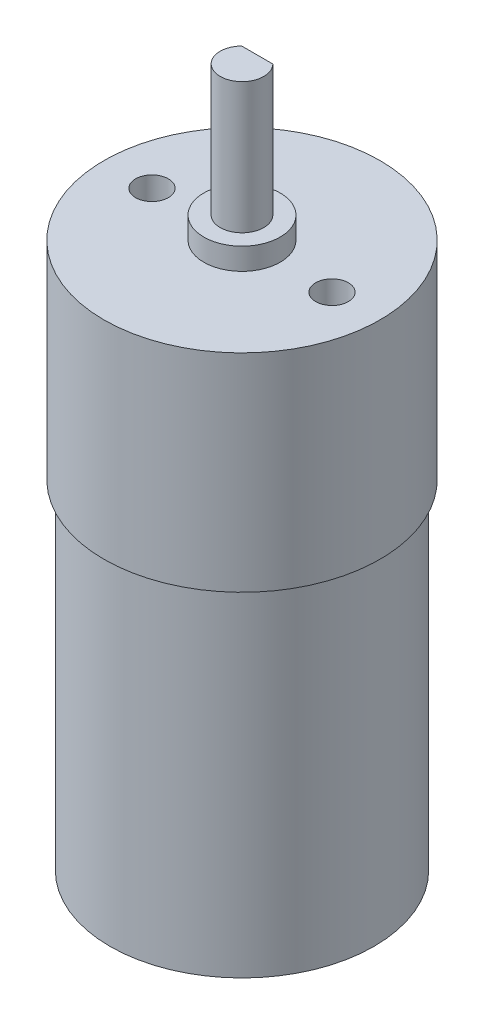
ISO-10303-21;
HEADER;
FILE_DESCRIPTION(('STEP AP214'),'2;1');
FILE_NAME('part.step','',(''),(''),'','','');
FILE_SCHEMA(('AUTOMOTIVE_DESIGN { 1 0 10303 214 1 1 1 1 }'));
ENDSEC;
DATA;
#1=APPLICATION_CONTEXT('core data for automotive mechanical design processes');
#2=APPLICATION_PROTOCOL_DEFINITION('international standard','automotive_design',2000,#1);
#3=PRODUCT_CONTEXT('',#1,'mechanical');
#4=PRODUCT('Part','Part','',(#3));
#5=PRODUCT_RELATED_PRODUCT_CATEGORY('part','',(#4));
#6=PRODUCT_DEFINITION_FORMATION('','',#4);
#7=PRODUCT_DEFINITION_CONTEXT('part definition',#1,'design');
#8=PRODUCT_DEFINITION('design','',#6,#7);
#9=PRODUCT_DEFINITION_SHAPE('','',#8);
#10=(LENGTH_UNIT() NAMED_UNIT(*) SI_UNIT(.MILLI.,.METRE.));
#11=(NAMED_UNIT(*) PLANE_ANGLE_UNIT() SI_UNIT($,.RADIAN.));
#12=(NAMED_UNIT(*) SI_UNIT($,.STERADIAN.) SOLID_ANGLE_UNIT());
#13=UNCERTAINTY_MEASURE_WITH_UNIT(LENGTH_MEASURE(1.E-05),#10,'distance_accuracy_value','');
#14=(GEOMETRIC_REPRESENTATION_CONTEXT(3) GLOBAL_UNCERTAINTY_ASSIGNED_CONTEXT((#13)) GLOBAL_UNIT_ASSIGNED_CONTEXT((#10,
#11,#12)) REPRESENTATION_CONTEXT('',''));
#15=CARTESIAN_POINT('',(0.,0.,0.));
#16=DIRECTION('',(0.,0.,1.));
#17=DIRECTION('',(1.,0.,0.));
#18=AXIS2_PLACEMENT_3D('',#15,#16,#17);
#19=CARTESIAN_POINT('',(0.,31.,0.));
#20=DIRECTION('',(0.,-1.,0.));
#21=DIRECTION('',(0.,0.,-1.));
#22=AXIS2_PLACEMENT_3D('',#19,#20,#21);
#23=CYLINDRICAL_SURFACE('',#22,12.1);
#24=CARTESIAN_POINT('',(0.,31.,0.));
#25=DIRECTION('',(0.,1.,0.));
#26=DIRECTION('',(0.,0.,1.));
#27=AXIS2_PLACEMENT_3D('',#24,#25,#26);
#28=CIRCLE('',#27,12.1);
#29=CARTESIAN_POINT('',(0.,31.,12.1));
#30=VERTEX_POINT('',#29);
#31=EDGE_CURVE('E11',#30,#30,#28,.T.);
#32=ORIENTED_EDGE('',*,*,#31,.F.);
#33=EDGE_LOOP('',(#32));
#34=FACE_BOUND('',#33,.T.);
#35=CARTESIAN_POINT('',(0.,0.,0.));
#36=DIRECTION('',(0.,1.,0.));
#37=DIRECTION('',(0.,0.,1.));
#38=AXIS2_PLACEMENT_3D('',#35,#36,#37);
#39=CIRCLE('',#38,12.1);
#40=CARTESIAN_POINT('',(0.,0.,12.1));
#41=VERTEX_POINT('',#40);
#42=EDGE_CURVE('E38',#41,#41,#39,.T.);
#43=ORIENTED_EDGE('',*,*,#42,.T.);
#44=EDGE_LOOP('',(#43));
#45=FACE_BOUND('',#44,.T.);
#46=ADVANCED_FACE('F35',(#34,#45),#23,.T.);
#47=CARTESIAN_POINT('',(0.,0.,0.));
#48=DIRECTION('',(0.,1.,0.));
#49=DIRECTION('',(0.,0.,1.));
#50=AXIS2_PLACEMENT_3D('',#47,#48,#49);
#51=PLANE('',#50);
#52=ORIENTED_EDGE('',*,*,#42,.F.);
#53=EDGE_LOOP('',(#52));
#54=FACE_BOUND('',#53,.T.);
#55=ADVANCED_FACE('F116',(#54),#51,.F.);
#56=CARTESIAN_POINT('',(0.,50.,0.));
#57=DIRECTION('',(0.,-1.,0.));
#58=DIRECTION('',(0.,0.,-1.));
#59=AXIS2_PLACEMENT_3D('',#56,#57,#58);
#60=CYLINDRICAL_SURFACE('',#59,12.65);
#61=CARTESIAN_POINT('',(0.,50.,0.));
#62=DIRECTION('',(0.,1.,0.));
#63=DIRECTION('',(0.,0.,1.));
#64=AXIS2_PLACEMENT_3D('',#61,#62,#63);
#65=CIRCLE('',#64,12.65);
#66=CARTESIAN_POINT('',(0.,50.,12.65));
#67=VERTEX_POINT('',#66);
#68=EDGE_CURVE('E91',#67,#67,#65,.T.);
#69=ORIENTED_EDGE('',*,*,#68,.F.);
#70=EDGE_LOOP('',(#69));
#71=FACE_BOUND('',#70,.T.);
#72=CARTESIAN_POINT('',(0.,31.,0.));
#73=DIRECTION('',(0.,1.,0.));
#74=DIRECTION('',(0.,0.,1.));
#75=AXIS2_PLACEMENT_3D('',#72,#73,#74);
#76=CIRCLE('',#75,12.65);
#77=CARTESIAN_POINT('',(0.,31.,12.65));
#78=VERTEX_POINT('',#77);
#79=EDGE_CURVE('E89',#78,#78,#76,.T.);
#80=ORIENTED_EDGE('',*,*,#79,.T.);
#81=EDGE_LOOP('',(#80));
#82=FACE_BOUND('',#81,.T.);
#83=ADVANCED_FACE('F97',(#71,#82),#60,.T.);
#84=CARTESIAN_POINT('',(0.,50.,0.));
#85=DIRECTION('',(0.,1.,0.));
#86=DIRECTION('',(0.,0.,1.));
#87=AXIS2_PLACEMENT_3D('',#84,#85,#86);
#88=PLANE('',#87);
#89=CARTESIAN_POINT('',(-8.25,50.,0.));
#90=DIRECTION('',(0.,1.,0.));
#91=DIRECTION('',(0.,0.,1.));
#92=AXIS2_PLACEMENT_3D('',#89,#90,#91);
#93=CIRCLE('',#92,1.5);
#94=CARTESIAN_POINT('',(-8.25,50.,1.5));
#95=VERTEX_POINT('',#94);
#96=EDGE_CURVE('E72',#95,#95,#93,.T.);
#97=ORIENTED_EDGE('',*,*,#96,.F.);
#98=EDGE_LOOP('',(#97));
#99=FACE_BOUND('',#98,.T.);
#100=CARTESIAN_POINT('',(8.25,50.,0.));
#101=DIRECTION('',(0.,1.,0.));
#102=DIRECTION('',(0.,0.,1.));
#103=AXIS2_PLACEMENT_3D('',#100,#101,#102);
#104=CIRCLE('',#103,1.5);
#105=CARTESIAN_POINT('',(8.25,50.,1.5));
#106=VERTEX_POINT('',#105);
#107=EDGE_CURVE('E85',#106,#106,#104,.T.);
#108=ORIENTED_EDGE('',*,*,#107,.F.);
#109=EDGE_LOOP('',(#108));
#110=FACE_BOUND('',#109,.T.);
#111=CARTESIAN_POINT('',(0.,50.,0.));
#112=DIRECTION('',(0.,1.,0.));
#113=DIRECTION('',(0.,0.,1.));
#114=AXIS2_PLACEMENT_3D('',#111,#112,#113);
#115=CIRCLE('',#114,3.5);
#116=CARTESIAN_POINT('',(0.,50.,3.5));
#117=VERTEX_POINT('',#116);
#118=EDGE_CURVE('E75',#117,#117,#115,.T.);
#119=ORIENTED_EDGE('',*,*,#118,.F.);
#120=EDGE_LOOP('',(#119));
#121=FACE_BOUND('',#120,.T.);
#122=ORIENTED_EDGE('',*,*,#68,.T.);
#123=EDGE_LOOP('',(#122));
#124=FACE_BOUND('',#123,.T.);
#125=ADVANCED_FACE('F102',(#99,#110,#121,#124),#88,.T.);
#126=CARTESIAN_POINT('',(0.,31.,0.));
#127=DIRECTION('',(0.,1.,0.));
#128=DIRECTION('',(0.,0.,1.));
#129=AXIS2_PLACEMENT_3D('',#126,#127,#128);
#130=PLANE('',#129);
#131=ORIENTED_EDGE('',*,*,#31,.T.);
#132=EDGE_LOOP('',(#131));
#133=FACE_BOUND('',#132,.T.);
#134=ORIENTED_EDGE('',*,*,#79,.F.);
#135=EDGE_LOOP('',(#134));
#136=FACE_BOUND('',#135,.T.);
#137=ADVANCED_FACE('F99',(#133,#136),#130,.F.);
#138=CARTESIAN_POINT('',(0.,52.,0.));
#139=DIRECTION('',(0.,-1.,0.));
#140=DIRECTION('',(0.,0.,-1.));
#141=AXIS2_PLACEMENT_3D('',#138,#139,#140);
#142=CYLINDRICAL_SURFACE('',#141,3.5);
#143=CARTESIAN_POINT('',(0.,52.,0.));
#144=DIRECTION('',(0.,1.,0.));
#145=DIRECTION('',(0.,0.,1.));
#146=AXIS2_PLACEMENT_3D('',#143,#144,#145);
#147=CIRCLE('',#146,3.5);
#148=CARTESIAN_POINT('',(0.,52.,3.5));
#149=VERTEX_POINT('',#148);
#150=EDGE_CURVE('E79',#149,#149,#147,.T.);
#151=ORIENTED_EDGE('',*,*,#150,.F.);
#152=EDGE_LOOP('',(#151));
#153=FACE_BOUND('',#152,.T.);
#154=ORIENTED_EDGE('',*,*,#118,.T.);
#155=EDGE_LOOP('',(#154));
#156=FACE_BOUND('',#155,.T.);
#157=ADVANCED_FACE('F101',(#153,#156),#142,.T.);
#158=CARTESIAN_POINT('',(0.,52.,0.));
#159=DIRECTION('',(0.,1.,0.));
#160=DIRECTION('',(0.,0.,1.));
#161=AXIS2_PLACEMENT_3D('',#158,#159,#160);
#162=PLANE('',#161);
#163=CARTESIAN_POINT('',(0.,52.,0.));
#164=DIRECTION('',(0.,1.,0.));
#165=DIRECTION('',(0.,0.,1.));
#166=AXIS2_PLACEMENT_3D('',#163,#164,#165);
#167=CIRCLE('',#166,2.);
#168=CARTESIAN_POINT('',(0.,52.,2.));
#169=VERTEX_POINT('',#168);
#170=EDGE_CURVE('E76',#169,#169,#167,.T.);
#171=ORIENTED_EDGE('',*,*,#170,.F.);
#172=EDGE_LOOP('',(#171));
#173=FACE_BOUND('',#172,.T.);
#174=ORIENTED_EDGE('',*,*,#150,.T.);
#175=EDGE_LOOP('',(#174));
#176=FACE_BOUND('',#175,.T.);
#177=ADVANCED_FACE('F109',(#173,#176),#162,.T.);
#178=CARTESIAN_POINT('',(0.,64.,0.));
#179=DIRECTION('',(0.,-1.,0.));
#180=DIRECTION('',(0.,0.,-1.));
#181=AXIS2_PLACEMENT_3D('',#178,#179,#180);
#182=CYLINDRICAL_SURFACE('',#181,2.);
#183=CARTESIAN_POINT('',(0.,64.,0.));
#184=DIRECTION('',(0.,1.,0.));
#185=DIRECTION('',(0.,0.,1.));
#186=AXIS2_PLACEMENT_3D('',#183,#184,#185);
#187=CIRCLE('',#186,2.);
#188=CARTESIAN_POINT('',(-1.42828568570857,64.,-1.4));
#189=VERTEX_POINT('',#188);
#190=CARTESIAN_POINT('',(1.42828568570857,64.,-1.4));
#191=VERTEX_POINT('',#190);
#192=EDGE_CURVE('E71',#189,#191,#187,.T.);
#193=ORIENTED_EDGE('',*,*,#192,.F.);
#194=DIRECTION('',(0.,1.,0.));
#195=VECTOR('',#194,1.);
#196=CARTESIAN_POINT('',(-1.42828568570857,54.,-1.4));
#197=LINE('',#196,#195);
#198=CARTESIAN_POINT('',(-1.42828568570857,54.,-1.4));
#199=VERTEX_POINT('',#198);
#200=EDGE_CURVE('E49',#199,#189,#197,.T.);
#201=ORIENTED_EDGE('',*,*,#200,.F.);
#202=CARTESIAN_POINT('',(0.,54.,0.));
#203=DIRECTION('',(0.,1.,0.));
#204=DIRECTION('',(0.,0.,-1.));
#205=AXIS2_PLACEMENT_3D('',#202,#203,#204);
#206=CIRCLE('',#205,2.);
#207=CARTESIAN_POINT('',(1.42828568570857,54.,-1.4));
#208=VERTEX_POINT('',#207);
#209=EDGE_CURVE('E65',#208,#199,#206,.T.);
#210=ORIENTED_EDGE('',*,*,#209,.F.);
#211=DIRECTION('',(0.,1.,0.));
#212=VECTOR('',#211,1.);
#213=CARTESIAN_POINT('',(1.42828568570857,54.,-1.4));
#214=LINE('',#213,#212);
#215=EDGE_CURVE('E55',#208,#191,#214,.T.);
#216=ORIENTED_EDGE('',*,*,#215,.T.);
#217=EDGE_LOOP('',(#193,#201,#210,#216));
#218=FACE_BOUND('',#217,.T.);
#219=ORIENTED_EDGE('',*,*,#170,.T.);
#220=EDGE_LOOP('',(#219));
#221=FACE_BOUND('',#220,.T.);
#222=ADVANCED_FACE('F69',(#218,#221),#182,.T.);
#223=CARTESIAN_POINT('',(0.,64.,0.));
#224=DIRECTION('',(0.,1.,0.));
#225=DIRECTION('',(0.,0.,1.));
#226=AXIS2_PLACEMENT_3D('',#223,#224,#225);
#227=PLANE('',#226);
#228=DIRECTION('',(1.,0.,0.));
#229=VECTOR('',#228,1.);
#230=CARTESIAN_POINT('',(-1.42828568570857,64.,-1.4));
#231=LINE('',#230,#229);
#232=EDGE_CURVE('E60',#189,#191,#231,.T.);
#233=ORIENTED_EDGE('',*,*,#232,.F.);
#234=ORIENTED_EDGE('',*,*,#192,.T.);
#235=EDGE_LOOP('',(#233,#234));
#236=FACE_BOUND('',#235,.T.);
#237=ADVANCED_FACE('F74',(#236),#227,.T.);
#238=CARTESIAN_POINT('',(8.25,44.,0.));
#239=DIRECTION('',(0.,1.,0.));
#240=DIRECTION('',(0.,0.,1.));
#241=AXIS2_PLACEMENT_3D('',#238,#239,#240);
#242=CYLINDRICAL_SURFACE('',#241,1.5);
#243=CARTESIAN_POINT('',(8.25,44.,0.));
#244=DIRECTION('',(0.,1.,0.));
#245=DIRECTION('',(0.,0.,1.));
#246=AXIS2_PLACEMENT_3D('',#243,#244,#245);
#247=CIRCLE('',#246,1.5);
#248=CARTESIAN_POINT('',(8.25,44.,1.5));
#249=VERTEX_POINT('',#248);
#250=EDGE_CURVE('E82',#249,#249,#247,.T.);
#251=ORIENTED_EDGE('',*,*,#250,.F.);
#252=EDGE_LOOP('',(#251));
#253=FACE_BOUND('',#252,.T.);
#254=ORIENTED_EDGE('',*,*,#107,.T.);
#255=EDGE_LOOP('',(#254));
#256=FACE_BOUND('',#255,.T.);
#257=ADVANCED_FACE('F149',(#253,#256),#242,.F.);
#258=CARTESIAN_POINT('',(8.25,44.,0.));
#259=DIRECTION('',(0.,1.,0.));
#260=DIRECTION('',(0.,0.,1.));
#261=AXIS2_PLACEMENT_3D('',#258,#259,#260);
#262=PLANE('',#261);
#263=ORIENTED_EDGE('',*,*,#250,.T.);
#264=EDGE_LOOP('',(#263));
#265=FACE_BOUND('',#264,.T.);
#266=ADVANCED_FACE('F154',(#265),#262,.T.);
#267=CARTESIAN_POINT('',(-8.25,44.,0.));
#268=DIRECTION('',(0.,1.,0.));
#269=DIRECTION('',(0.,0.,1.));
#270=AXIS2_PLACEMENT_3D('',#267,#268,#269);
#271=CYLINDRICAL_SURFACE('',#270,1.5);
#272=CARTESIAN_POINT('',(-8.25,44.,0.));
#273=DIRECTION('',(0.,1.,0.));
#274=DIRECTION('',(0.,0.,1.));
#275=AXIS2_PLACEMENT_3D('',#272,#273,#274);
#276=CIRCLE('',#275,1.5);
#277=CARTESIAN_POINT('',(-8.25,44.,1.5));
#278=VERTEX_POINT('',#277);
#279=EDGE_CURVE('E246',#278,#278,#276,.T.);
#280=ORIENTED_EDGE('',*,*,#279,.F.);
#281=EDGE_LOOP('',(#280));
#282=FACE_BOUND('',#281,.T.);
#283=ORIENTED_EDGE('',*,*,#96,.T.);
#284=EDGE_LOOP('',(#283));
#285=FACE_BOUND('',#284,.T.);
#286=ADVANCED_FACE('F166',(#282,#285),#271,.F.);
#287=CARTESIAN_POINT('',(-8.25,44.,0.));
#288=DIRECTION('',(0.,1.,0.));
#289=DIRECTION('',(0.,0.,1.));
#290=AXIS2_PLACEMENT_3D('',#287,#288,#289);
#291=PLANE('',#290);
#292=ORIENTED_EDGE('',*,*,#279,.T.);
#293=EDGE_LOOP('',(#292));
#294=FACE_BOUND('',#293,.T.);
#295=ADVANCED_FACE('F176',(#294),#291,.T.);
#296=CARTESIAN_POINT('',(-1.42828568570857,54.,-1.4));
#297=DIRECTION('',(0.,0.,1.));
#298=DIRECTION('',(1.,0.,0.));
#299=AXIS2_PLACEMENT_3D('',#296,#297,#298);
#300=PLANE('',#299);
#301=ORIENTED_EDGE('',*,*,#232,.T.);
#302=ORIENTED_EDGE('',*,*,#215,.F.);
#303=DIRECTION('',(1.,0.,0.));
#304=VECTOR('',#303,1.);
#305=CARTESIAN_POINT('',(-1.42828568570857,54.,-1.4));
#306=LINE('',#305,#304);
#307=EDGE_CURVE('E241',#199,#208,#306,.T.);
#308=ORIENTED_EDGE('',*,*,#307,.F.);
#309=ORIENTED_EDGE('',*,*,#200,.T.);
#310=EDGE_LOOP('',(#301,#302,#308,#309));
#311=FACE_BOUND('',#310,.T.);
#312=ADVANCED_FACE('F61',(#311),#300,.F.);
#313=CARTESIAN_POINT('',(0.,54.,0.));
#314=DIRECTION('',(0.,-1.,0.));
#315=DIRECTION('',(0.,0.,-1.));
#316=AXIS2_PLACEMENT_3D('',#313,#314,#315);
#317=PLANE('',#316);
#318=ORIENTED_EDGE('',*,*,#209,.T.);
#319=ORIENTED_EDGE('',*,*,#307,.T.);
#320=EDGE_LOOP('',(#318,#319));
#321=FACE_BOUND('',#320,.T.);
#322=ADVANCED_FACE('F209',(#321),#317,.F.);
#323=CLOSED_SHELL('',(#46,#55,#83,#125,#137,#157,#177,#222,#237,#257,#266,#286,#295,#312,#322));
#324=MANIFOLD_SOLID_BREP('B2',#323);
#325=ADVANCED_BREP_SHAPE_REPRESENTATION('',(#18,#324),#14);
#326=SHAPE_DEFINITION_REPRESENTATION(#9,#325);
ENDSEC;
END-ISO-10303-21;
